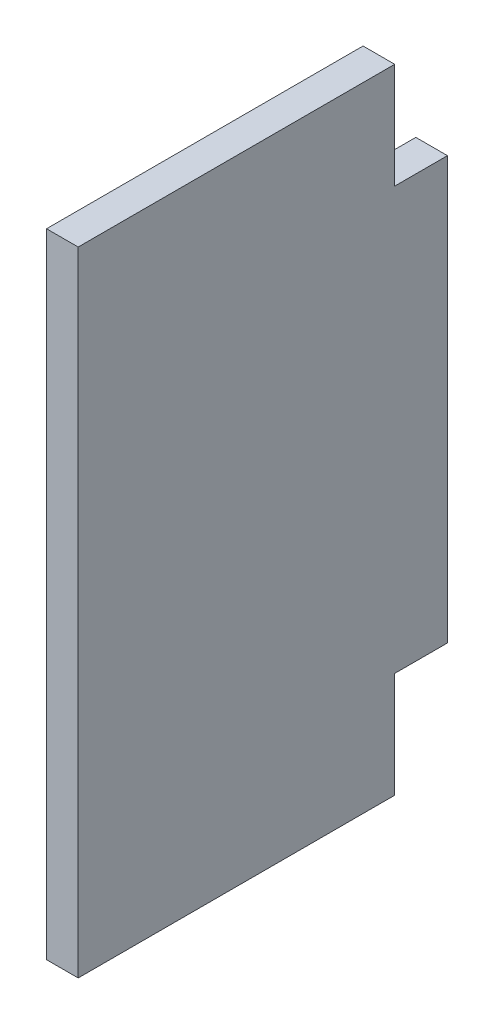
ISO-10303-21;
HEADER;
FILE_DESCRIPTION(('STEP AP214'),'2;1');
FILE_NAME('part.step','',(''),(''),'','','');
FILE_SCHEMA(('AUTOMOTIVE_DESIGN { 1 0 10303 214 1 1 1 1 }'));
ENDSEC;
DATA;
#1=APPLICATION_CONTEXT('core data for automotive mechanical design processes');
#2=APPLICATION_PROTOCOL_DEFINITION('international standard','automotive_design',2000,#1);
#3=PRODUCT_CONTEXT('',#1,'mechanical');
#4=PRODUCT('Part','Part','',(#3));
#5=PRODUCT_RELATED_PRODUCT_CATEGORY('part','',(#4));
#6=PRODUCT_DEFINITION_FORMATION('','',#4);
#7=PRODUCT_DEFINITION_CONTEXT('part definition',#1,'design');
#8=PRODUCT_DEFINITION('design','',#6,#7);
#9=PRODUCT_DEFINITION_SHAPE('','',#8);
#10=(LENGTH_UNIT() NAMED_UNIT(*) SI_UNIT(.MILLI.,.METRE.));
#11=(NAMED_UNIT(*) PLANE_ANGLE_UNIT() SI_UNIT($,.RADIAN.));
#12=(NAMED_UNIT(*) SI_UNIT($,.STERADIAN.) SOLID_ANGLE_UNIT());
#13=UNCERTAINTY_MEASURE_WITH_UNIT(LENGTH_MEASURE(1.E-05),#10,'distance_accuracy_value','');
#14=(GEOMETRIC_REPRESENTATION_CONTEXT(3) GLOBAL_UNCERTAINTY_ASSIGNED_CONTEXT((#13)) GLOBAL_UNIT_ASSIGNED_CONTEXT((#10,
#11,#12)) REPRESENTATION_CONTEXT('',''));
#15=CARTESIAN_POINT('',(0.,0.,0.));
#16=DIRECTION('',(0.,0.,1.));
#17=DIRECTION('',(1.,0.,0.));
#18=AXIS2_PLACEMENT_3D('',#15,#16,#17);
#19=CARTESIAN_POINT('',(89.5422981032107,-20.,-45.1123422402632));
#20=DIRECTION('',(0.,-1.,0.));
#21=DIRECTION('',(0.,0.,-1.));
#22=AXIS2_PLACEMENT_3D('',#19,#20,#21);
#23=PLANE('',#22);
#24=DIRECTION('',(0.,0.,1.));
#25=VECTOR('',#24,1.);
#26=CARTESIAN_POINT('',(89.5422981032107,-20.,-45.1123422402632));
#27=LINE('',#26,#25);
#28=CARTESIAN_POINT('',(89.5422981032107,-20.,-5.));
#29=VERTEX_POINT('',#28);
#30=CARTESIAN_POINT('',(89.5422981032107,-20.,0.));
#31=VERTEX_POINT('',#30);
#32=EDGE_CURVE('E140',#29,#31,#27,.T.);
#33=ORIENTED_EDGE('',*,*,#32,.T.);
#34=DIRECTION('',(-1.,0.,0.));
#35=VECTOR('',#34,1.);
#36=CARTESIAN_POINT('',(86.5422981032107,-20.,0.));
#37=LINE('',#36,#35);
#38=CARTESIAN_POINT('',(86.5422981032107,-20.,0.));
#39=VERTEX_POINT('',#38);
#40=EDGE_CURVE('E118',#31,#39,#37,.T.);
#41=ORIENTED_EDGE('',*,*,#40,.T.);
#42=DIRECTION('',(0.,0.,1.));
#43=VECTOR('',#42,1.);
#44=CARTESIAN_POINT('',(86.5422981032107,-20.,-45.1123422402632));
#45=LINE('',#44,#43);
#46=CARTESIAN_POINT('',(86.5422981032107,-20.,-5.));
#47=VERTEX_POINT('',#46);
#48=EDGE_CURVE('E107',#47,#39,#45,.T.);
#49=ORIENTED_EDGE('',*,*,#48,.F.);
#50=DIRECTION('',(-1.,0.,0.));
#51=VECTOR('',#50,1.);
#52=CARTESIAN_POINT('',(89.5422981032107,-20.,-5.));
#53=LINE('',#52,#51);
#54=EDGE_CURVE('E143',#29,#47,#53,.T.);
#55=ORIENTED_EDGE('',*,*,#54,.F.);
#56=EDGE_LOOP('',(#33,#41,#49,#55));
#57=FACE_BOUND('',#56,.T.);
#58=ADVANCED_FACE('F33',(#57),#23,.T.);
#59=CARTESIAN_POINT('',(89.5422981032107,20.,-45.1123422402632));
#60=DIRECTION('',(1.,0.,0.));
#61=DIRECTION('',(0.,0.,-1.));
#62=AXIS2_PLACEMENT_3D('',#59,#60,#61);
#63=PLANE('',#62);
#64=DIRECTION('',(0.,-1.,0.));
#65=VECTOR('',#64,1.);
#66=CARTESIAN_POINT('',(89.5422981032107,20.,-5.));
#67=LINE('',#66,#65);
#68=CARTESIAN_POINT('',(89.5422981032107,20.,-5.));
#69=VERTEX_POINT('',#68);
#70=EDGE_CURVE('E42',#69,#29,#67,.T.);
#71=ORIENTED_EDGE('',*,*,#70,.F.);
#72=DIRECTION('',(0.,0.,1.));
#73=VECTOR('',#72,1.);
#74=CARTESIAN_POINT('',(89.5422981032107,20.,-45.1123422402632));
#75=LINE('',#74,#73);
#76=CARTESIAN_POINT('',(89.5422981032107,20.,0.));
#77=VERTEX_POINT('',#76);
#78=EDGE_CURVE('E161',#69,#77,#75,.T.);
#79=ORIENTED_EDGE('',*,*,#78,.T.);
#80=DIRECTION('',(0.,-1.,0.));
#81=VECTOR('',#80,1.);
#82=CARTESIAN_POINT('',(89.5422981032107,30.,0.));
#83=LINE('',#82,#81);
#84=CARTESIAN_POINT('',(89.5422981032107,30.,0.));
#85=VERTEX_POINT('',#84);
#86=EDGE_CURVE('E175',#85,#77,#83,.T.);
#87=ORIENTED_EDGE('',*,*,#86,.F.);
#88=DIRECTION('',(0.,0.,-1.));
#89=VECTOR('',#88,1.);
#90=CARTESIAN_POINT('',(89.5422981032107,30.,0.));
#91=LINE('',#90,#89);
#92=CARTESIAN_POINT('',(89.5422981032107,30.,30.));
#93=VERTEX_POINT('',#92);
#94=EDGE_CURVE('E190',#93,#85,#91,.T.);
#95=ORIENTED_EDGE('',*,*,#94,.F.);
#96=DIRECTION('',(0.,1.,0.));
#97=VECTOR('',#96,1.);
#98=CARTESIAN_POINT('',(89.5422981032107,20.,30.));
#99=LINE('',#98,#97);
#100=CARTESIAN_POINT('',(89.5422981032107,-30.,30.));
#101=VERTEX_POINT('',#100);
#102=EDGE_CURVE('E173',#101,#93,#99,.T.);
#103=ORIENTED_EDGE('',*,*,#102,.F.);
#104=DIRECTION('',(0.,0.,-1.));
#105=VECTOR('',#104,1.);
#106=CARTESIAN_POINT('',(89.5422981032107,-30.,0.));
#107=LINE('',#106,#105);
#108=CARTESIAN_POINT('',(89.5422981032107,-30.,0.));
#109=VERTEX_POINT('',#108);
#110=EDGE_CURVE('E121',#101,#109,#107,.T.);
#111=ORIENTED_EDGE('',*,*,#110,.T.);
#112=DIRECTION('',(0.,1.,0.));
#113=VECTOR('',#112,1.);
#114=CARTESIAN_POINT('',(89.5422981032107,-30.,0.));
#115=LINE('',#114,#113);
#116=EDGE_CURVE('E108',#109,#31,#115,.T.);
#117=ORIENTED_EDGE('',*,*,#116,.T.);
#118=ORIENTED_EDGE('',*,*,#32,.F.);
#119=EDGE_LOOP('',(#71,#79,#87,#95,#103,#111,#117,#118));
#120=FACE_BOUND('',#119,.T.);
#121=ADVANCED_FACE('F35',(#120),#63,.T.);
#122=CARTESIAN_POINT('',(86.5422981032107,20.,-45.1123422402632));
#123=DIRECTION('',(-1.,0.,0.));
#124=DIRECTION('',(0.,0.,1.));
#125=AXIS2_PLACEMENT_3D('',#122,#123,#124);
#126=PLANE('',#125);
#127=DIRECTION('',(0.,1.,0.));
#128=VECTOR('',#127,1.);
#129=CARTESIAN_POINT('',(86.5422981032107,20.,-5.));
#130=LINE('',#129,#128);
#131=CARTESIAN_POINT('',(86.5422981032107,20.,-5.));
#132=VERTEX_POINT('',#131);
#133=EDGE_CURVE('E144',#47,#132,#130,.T.);
#134=ORIENTED_EDGE('',*,*,#133,.F.);
#135=ORIENTED_EDGE('',*,*,#48,.T.);
#136=DIRECTION('',(0.,1.,0.));
#137=VECTOR('',#136,1.);
#138=CARTESIAN_POINT('',(86.5422981032107,-30.,0.));
#139=LINE('',#138,#137);
#140=CARTESIAN_POINT('',(86.5422981032107,-30.,0.));
#141=VERTEX_POINT('',#140);
#142=EDGE_CURVE('E50',#141,#39,#139,.T.);
#143=ORIENTED_EDGE('',*,*,#142,.F.);
#144=DIRECTION('',(0.,0.,1.));
#145=VECTOR('',#144,1.);
#146=CARTESIAN_POINT('',(86.5422981032107,-30.,0.));
#147=LINE('',#146,#145);
#148=CARTESIAN_POINT('',(86.5422981032107,-30.,30.));
#149=VERTEX_POINT('',#148);
#150=EDGE_CURVE('E104',#141,#149,#147,.T.);
#151=ORIENTED_EDGE('',*,*,#150,.T.);
#152=DIRECTION('',(0.,-1.,0.));
#153=VECTOR('',#152,1.);
#154=CARTESIAN_POINT('',(86.5422981032107,20.,30.));
#155=LINE('',#154,#153);
#156=CARTESIAN_POINT('',(86.5422981032107,30.,30.));
#157=VERTEX_POINT('',#156);
#158=EDGE_CURVE('E163',#157,#149,#155,.T.);
#159=ORIENTED_EDGE('',*,*,#158,.F.);
#160=DIRECTION('',(0.,0.,1.));
#161=VECTOR('',#160,1.);
#162=CARTESIAN_POINT('',(86.5422981032107,30.,0.));
#163=LINE('',#162,#161);
#164=CARTESIAN_POINT('',(86.5422981032107,30.,0.));
#165=VERTEX_POINT('',#164);
#166=EDGE_CURVE('E128',#165,#157,#163,.T.);
#167=ORIENTED_EDGE('',*,*,#166,.F.);
#168=DIRECTION('',(0.,-1.,0.));
#169=VECTOR('',#168,1.);
#170=CARTESIAN_POINT('',(86.5422981032107,30.,0.));
#171=LINE('',#170,#169);
#172=CARTESIAN_POINT('',(86.5422981032107,20.,0.));
#173=VERTEX_POINT('',#172);
#174=EDGE_CURVE('E166',#165,#173,#171,.T.);
#175=ORIENTED_EDGE('',*,*,#174,.T.);
#176=DIRECTION('',(0.,0.,1.));
#177=VECTOR('',#176,1.);
#178=CARTESIAN_POINT('',(86.5422981032107,20.,-45.1123422402632));
#179=LINE('',#178,#177);
#180=EDGE_CURVE('E146',#132,#173,#179,.T.);
#181=ORIENTED_EDGE('',*,*,#180,.F.);
#182=EDGE_LOOP('',(#134,#135,#143,#151,#159,#167,#175,#181));
#183=FACE_BOUND('',#182,.T.);
#184=ADVANCED_FACE('F103',(#183),#126,.T.);
#185=CARTESIAN_POINT('',(89.5422981032107,20.,-45.1123422402632));
#186=DIRECTION('',(0.,1.,0.));
#187=DIRECTION('',(0.,0.,1.));
#188=AXIS2_PLACEMENT_3D('',#185,#186,#187);
#189=PLANE('',#188);
#190=DIRECTION('',(-1.,0.,0.));
#191=VECTOR('',#190,1.);
#192=CARTESIAN_POINT('',(86.5422981032107,20.,0.));
#193=LINE('',#192,#191);
#194=EDGE_CURVE('E58',#77,#173,#193,.T.);
#195=ORIENTED_EDGE('',*,*,#194,.F.);
#196=ORIENTED_EDGE('',*,*,#78,.F.);
#197=DIRECTION('',(1.,0.,0.));
#198=VECTOR('',#197,1.);
#199=CARTESIAN_POINT('',(89.5422981032107,20.,-5.));
#200=LINE('',#199,#198);
#201=EDGE_CURVE('E11',#132,#69,#200,.T.);
#202=ORIENTED_EDGE('',*,*,#201,.F.);
#203=ORIENTED_EDGE('',*,*,#180,.T.);
#204=EDGE_LOOP('',(#195,#196,#202,#203));
#205=FACE_BOUND('',#204,.T.);
#206=ADVANCED_FACE('F181',(#205),#189,.T.);
#207=CARTESIAN_POINT('',(0.,0.,-5.));
#208=DIRECTION('',(0.,0.,1.));
#209=DIRECTION('',(0.,-1.,0.));
#210=AXIS2_PLACEMENT_3D('',#207,#208,#209);
#211=PLANE('',#210);
#212=ORIENTED_EDGE('',*,*,#70,.T.);
#213=ORIENTED_EDGE('',*,*,#54,.T.);
#214=ORIENTED_EDGE('',*,*,#133,.T.);
#215=ORIENTED_EDGE('',*,*,#201,.T.);
#216=EDGE_LOOP('',(#212,#213,#214,#215));
#217=FACE_BOUND('',#216,.T.);
#218=ADVANCED_FACE('F177',(#217),#211,.F.);
#219=CARTESIAN_POINT('',(0.,0.,30.));
#220=DIRECTION('',(0.,0.,-1.));
#221=DIRECTION('',(-1.,0.,0.));
#222=AXIS2_PLACEMENT_3D('',#219,#220,#221);
#223=PLANE('',#222);
#224=ORIENTED_EDGE('',*,*,#102,.T.);
#225=DIRECTION('',(1.,0.,0.));
#226=VECTOR('',#225,1.);
#227=CARTESIAN_POINT('',(86.5422981032107,30.,30.));
#228=LINE('',#227,#226);
#229=EDGE_CURVE('E192',#157,#93,#228,.T.);
#230=ORIENTED_EDGE('',*,*,#229,.F.);
#231=ORIENTED_EDGE('',*,*,#158,.T.);
#232=DIRECTION('',(1.,0.,0.));
#233=VECTOR('',#232,1.);
#234=CARTESIAN_POINT('',(86.5422981032107,-30.,30.));
#235=LINE('',#234,#233);
#236=EDGE_CURVE('E117',#149,#101,#235,.T.);
#237=ORIENTED_EDGE('',*,*,#236,.T.);
#238=EDGE_LOOP('',(#224,#230,#231,#237));
#239=FACE_BOUND('',#238,.T.);
#240=ADVANCED_FACE('F204',(#239),#223,.F.);
#241=CARTESIAN_POINT('',(86.5422981032107,30.,0.));
#242=DIRECTION('',(0.,0.,1.));
#243=DIRECTION('',(1.,0.,0.));
#244=AXIS2_PLACEMENT_3D('',#241,#242,#243);
#245=PLANE('',#244);
#246=ORIENTED_EDGE('',*,*,#194,.T.);
#247=ORIENTED_EDGE('',*,*,#174,.F.);
#248=DIRECTION('',(-1.,0.,0.));
#249=VECTOR('',#248,1.);
#250=CARTESIAN_POINT('',(86.5422981032107,30.,0.));
#251=LINE('',#250,#249);
#252=EDGE_CURVE('E171',#85,#165,#251,.T.);
#253=ORIENTED_EDGE('',*,*,#252,.F.);
#254=ORIENTED_EDGE('',*,*,#86,.T.);
#255=EDGE_LOOP('',(#246,#247,#253,#254));
#256=FACE_BOUND('',#255,.T.);
#257=ADVANCED_FACE('F186',(#256),#245,.F.);
#258=CARTESIAN_POINT('',(0.,30.,0.));
#259=DIRECTION('',(0.,1.,0.));
#260=DIRECTION('',(0.,0.,1.));
#261=AXIS2_PLACEMENT_3D('',#258,#259,#260);
#262=PLANE('',#261);
#263=ORIENTED_EDGE('',*,*,#166,.T.);
#264=ORIENTED_EDGE('',*,*,#229,.T.);
#265=ORIENTED_EDGE('',*,*,#94,.T.);
#266=ORIENTED_EDGE('',*,*,#252,.T.);
#267=EDGE_LOOP('',(#263,#264,#265,#266));
#268=FACE_BOUND('',#267,.T.);
#269=ADVANCED_FACE('F196',(#268),#262,.T.);
#270=CARTESIAN_POINT('',(86.5422981032107,-30.,0.));
#271=DIRECTION('',(0.,0.,-1.));
#272=DIRECTION('',(-1.,0.,0.));
#273=AXIS2_PLACEMENT_3D('',#270,#271,#272);
#274=PLANE('',#273);
#275=ORIENTED_EDGE('',*,*,#40,.F.);
#276=ORIENTED_EDGE('',*,*,#116,.F.);
#277=DIRECTION('',(-1.,0.,0.));
#278=VECTOR('',#277,1.);
#279=CARTESIAN_POINT('',(86.5422981032107,-30.,0.));
#280=LINE('',#279,#278);
#281=EDGE_CURVE('E114',#109,#141,#280,.T.);
#282=ORIENTED_EDGE('',*,*,#281,.T.);
#283=ORIENTED_EDGE('',*,*,#142,.T.);
#284=EDGE_LOOP('',(#275,#276,#282,#283));
#285=FACE_BOUND('',#284,.T.);
#286=ADVANCED_FACE('F120',(#285),#274,.T.);
#287=CARTESIAN_POINT('',(0.,-30.,0.));
#288=DIRECTION('',(0.,-1.,0.));
#289=DIRECTION('',(0.,0.,1.));
#290=AXIS2_PLACEMENT_3D('',#287,#288,#289);
#291=PLANE('',#290);
#292=ORIENTED_EDGE('',*,*,#150,.F.);
#293=ORIENTED_EDGE('',*,*,#281,.F.);
#294=ORIENTED_EDGE('',*,*,#110,.F.);
#295=ORIENTED_EDGE('',*,*,#236,.F.);
#296=EDGE_LOOP('',(#292,#293,#294,#295));
#297=FACE_BOUND('',#296,.T.);
#298=ADVANCED_FACE('F112',(#297),#291,.T.);
#299=CLOSED_SHELL('',(#58,#121,#184,#206,#218,#240,#257,#269,#286,#298));
#300=MANIFOLD_SOLID_BREP('B2',#299);
#301=ADVANCED_BREP_SHAPE_REPRESENTATION('',(#18,#300),#14);
#302=SHAPE_DEFINITION_REPRESENTATION(#9,#301);
ENDSEC;
END-ISO-10303-21;
